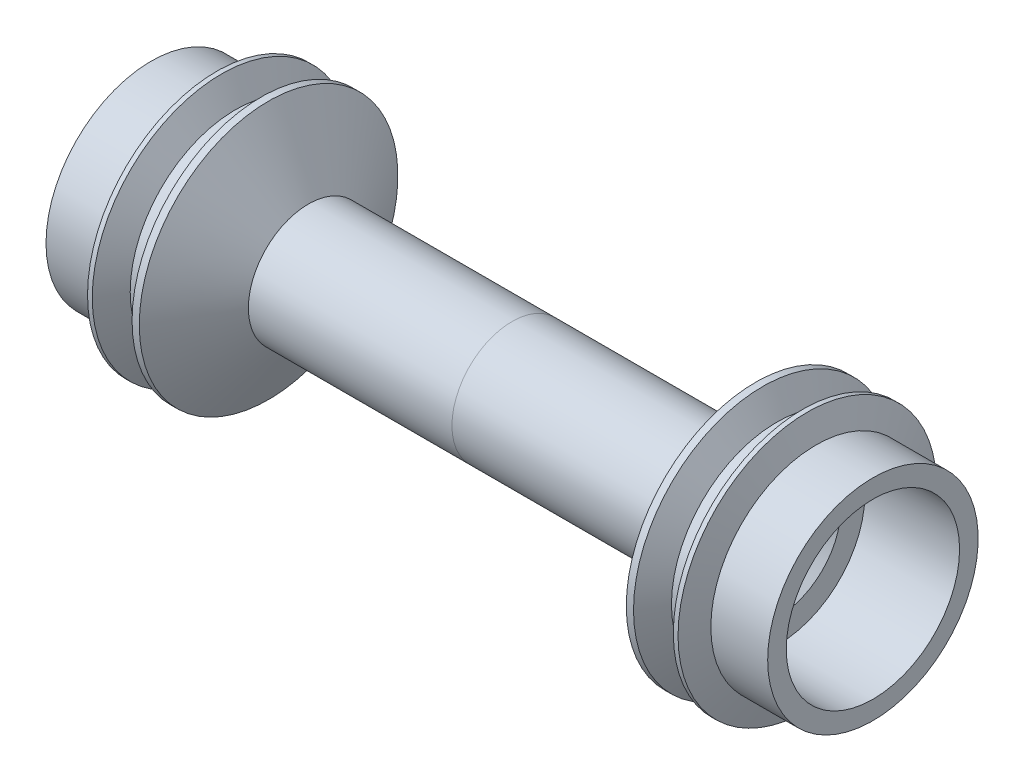
ISO-10303-21;
HEADER;
FILE_DESCRIPTION(('STEP AP214'),'2;1');
FILE_NAME('part.step','',(''),(''),'','','');
FILE_SCHEMA(('AUTOMOTIVE_DESIGN { 1 0 10303 214 1 1 1 1 }'));
ENDSEC;
DATA;
#1=APPLICATION_CONTEXT('core data for automotive mechanical design processes');
#2=APPLICATION_PROTOCOL_DEFINITION('international standard','automotive_design',2000,#1);
#3=PRODUCT_CONTEXT('',#1,'mechanical');
#4=PRODUCT('Part','Part','',(#3));
#5=PRODUCT_RELATED_PRODUCT_CATEGORY('part','',(#4));
#6=PRODUCT_DEFINITION_FORMATION('','',#4);
#7=PRODUCT_DEFINITION_CONTEXT('part definition',#1,'design');
#8=PRODUCT_DEFINITION('design','',#6,#7);
#9=PRODUCT_DEFINITION_SHAPE('','',#8);
#10=(LENGTH_UNIT() NAMED_UNIT(*) SI_UNIT(.MILLI.,.METRE.));
#11=(NAMED_UNIT(*) PLANE_ANGLE_UNIT() SI_UNIT($,.RADIAN.));
#12=(NAMED_UNIT(*) SI_UNIT($,.STERADIAN.) SOLID_ANGLE_UNIT());
#13=UNCERTAINTY_MEASURE_WITH_UNIT(LENGTH_MEASURE(1.E-05),#10,'distance_accuracy_value','');
#14=(GEOMETRIC_REPRESENTATION_CONTEXT(3) GLOBAL_UNCERTAINTY_ASSIGNED_CONTEXT((#13)) GLOBAL_UNIT_ASSIGNED_CONTEXT((#10,
#11,#12)) REPRESENTATION_CONTEXT('',''));
#15=CARTESIAN_POINT('',(0.,0.,0.));
#16=DIRECTION('',(0.,0.,1.));
#17=DIRECTION('',(1.,0.,0.));
#18=AXIS2_PLACEMENT_3D('',#15,#16,#17);
#19=CARTESIAN_POINT('',(13.97,0.,0.));
#20=DIRECTION('',(-1.,0.,0.));
#21=DIRECTION('',(0.,0.,-1.));
#22=AXIS2_PLACEMENT_3D('',#19,#20,#21);
#23=CONICAL_SURFACE('',#22,5.55625,1.0471975511966);
#24=CARTESIAN_POINT('',(13.2367651581292,0.,0.));
#25=DIRECTION('',(-1.,0.,0.));
#26=DIRECTION('',(0.,0.,1.));
#27=AXIS2_PLACEMENT_3D('',#24,#25,#26);
#28=CIRCLE('',#27,6.82625);
#29=CARTESIAN_POINT('',(13.2367651581292,0.,6.82625));
#30=VERTEX_POINT('',#29);
#31=EDGE_CURVE('E177',#30,#30,#28,.T.);
#32=ORIENTED_EDGE('',*,*,#31,.F.);
#33=EDGE_LOOP('',(#32));
#34=FACE_BOUND('',#33,.T.);
#35=CARTESIAN_POINT('',(13.97,0.,0.));
#36=DIRECTION('',(-1.,0.,0.));
#37=DIRECTION('',(0.,0.,1.));
#38=AXIS2_PLACEMENT_3D('',#35,#36,#37);
#39=CIRCLE('',#38,5.55625);
#40=CARTESIAN_POINT('',(13.97,0.,5.55625));
#41=VERTEX_POINT('',#40);
#42=EDGE_CURVE('E12',#41,#41,#39,.T.);
#43=ORIENTED_EDGE('',*,*,#42,.T.);
#44=EDGE_LOOP('',(#43));
#45=FACE_BOUND('',#44,.T.);
#46=ADVANCED_FACE('F59',(#34,#45),#23,.T.);
#47=CARTESIAN_POINT('',(19.05,0.,0.));
#48=DIRECTION('',(1.,0.,0.));
#49=DIRECTION('',(0.,0.,1.));
#50=AXIS2_PLACEMENT_3D('',#47,#48,#49);
#51=CYLINDRICAL_SURFACE('',#50,5.55625);
#52=ORIENTED_EDGE('',*,*,#42,.F.);
#53=EDGE_LOOP('',(#52));
#54=FACE_BOUND('',#53,.T.);
#55=CARTESIAN_POINT('',(14.605,0.,0.));
#56=DIRECTION('',(-1.,0.,0.));
#57=DIRECTION('',(0.,0.,1.));
#58=AXIS2_PLACEMENT_3D('',#55,#56,#57);
#59=CIRCLE('',#58,5.55625);
#60=CARTESIAN_POINT('',(14.605,0.,5.55625));
#61=VERTEX_POINT('',#60);
#62=EDGE_CURVE('E66',#61,#61,#59,.T.);
#63=ORIENTED_EDGE('',*,*,#62,.T.);
#64=EDGE_LOOP('',(#63));
#65=FACE_BOUND('',#64,.T.);
#66=ADVANCED_FACE('F131',(#54,#65),#51,.T.);
#67=CARTESIAN_POINT('',(15.3382348418708,0.,0.));
#68=DIRECTION('',(1.,0.,0.));
#69=DIRECTION('',(0.,0.,1.));
#70=AXIS2_PLACEMENT_3D('',#67,#68,#69);
#71=CONICAL_SURFACE('',#70,6.82625,1.0471975511966);
#72=ORIENTED_EDGE('',*,*,#62,.F.);
#73=EDGE_LOOP('',(#72));
#74=FACE_BOUND('',#73,.T.);
#75=CARTESIAN_POINT('',(15.3382348418708,0.,0.));
#76=DIRECTION('',(-1.,0.,0.));
#77=DIRECTION('',(0.,0.,1.));
#78=AXIS2_PLACEMENT_3D('',#75,#76,#77);
#79=CIRCLE('',#78,6.82625);
#80=CARTESIAN_POINT('',(15.3382348418708,0.,6.82625));
#81=VERTEX_POINT('',#80);
#82=EDGE_CURVE('E124',#81,#81,#79,.T.);
#83=ORIENTED_EDGE('',*,*,#82,.T.);
#84=EDGE_LOOP('',(#83));
#85=FACE_BOUND('',#84,.T.);
#86=ADVANCED_FACE('F133',(#74,#85),#71,.T.);
#87=CARTESIAN_POINT('',(19.05,0.,0.));
#88=DIRECTION('',(1.,0.,0.));
#89=DIRECTION('',(0.,0.,1.));
#90=AXIS2_PLACEMENT_3D('',#87,#88,#89);
#91=CYLINDRICAL_SURFACE('',#90,6.82625);
#92=ORIENTED_EDGE('',*,*,#82,.F.);
#93=EDGE_LOOP('',(#92));
#94=FACE_BOUND('',#93,.T.);
#95=CARTESIAN_POINT('',(15.5877578024819,0.,0.));
#96=DIRECTION('',(-1.,0.,0.));
#97=DIRECTION('',(0.,0.,1.));
#98=AXIS2_PLACEMENT_3D('',#95,#96,#97);
#99=CIRCLE('',#98,6.82625);
#100=CARTESIAN_POINT('',(15.5877578024819,0.,6.82625));
#101=VERTEX_POINT('',#100);
#102=EDGE_CURVE('E120',#101,#101,#99,.T.);
#103=ORIENTED_EDGE('',*,*,#102,.T.);
#104=EDGE_LOOP('',(#103));
#105=FACE_BOUND('',#104,.T.);
#106=ADVANCED_FACE('F136',(#94,#105),#91,.T.);
#107=CARTESIAN_POINT('',(16.05,0.,0.));
#108=DIRECTION('',(-1.,0.,0.));
#109=DIRECTION('',(0.,0.,-1.));
#110=AXIS2_PLACEMENT_3D('',#107,#108,#109);
#111=CONICAL_SURFACE('',#110,5.55625,1.22173047639603);
#112=ORIENTED_EDGE('',*,*,#102,.F.);
#113=EDGE_LOOP('',(#112));
#114=FACE_BOUND('',#113,.T.);
#115=CARTESIAN_POINT('',(16.05,0.,0.));
#116=DIRECTION('',(-1.,0.,0.));
#117=DIRECTION('',(0.,0.,1.));
#118=AXIS2_PLACEMENT_3D('',#115,#116,#117);
#119=CIRCLE('',#118,5.55625);
#120=CARTESIAN_POINT('',(16.05,0.,5.55625));
#121=VERTEX_POINT('',#120);
#122=EDGE_CURVE('E116',#121,#121,#119,.T.);
#123=ORIENTED_EDGE('',*,*,#122,.T.);
#124=EDGE_LOOP('',(#123));
#125=FACE_BOUND('',#124,.T.);
#126=ADVANCED_FACE('F142',(#114,#125),#111,.T.);
#127=CARTESIAN_POINT('',(19.05,0.,0.));
#128=DIRECTION('',(1.,0.,0.));
#129=DIRECTION('',(0.,0.,1.));
#130=AXIS2_PLACEMENT_3D('',#127,#128,#129);
#131=CYLINDRICAL_SURFACE('',#130,5.55625);
#132=ORIENTED_EDGE('',*,*,#122,.F.);
#133=EDGE_LOOP('',(#132));
#134=FACE_BOUND('',#133,.T.);
#135=CARTESIAN_POINT('',(19.05,0.,0.));
#136=DIRECTION('',(-1.,0.,0.));
#137=DIRECTION('',(0.,0.,1.));
#138=AXIS2_PLACEMENT_3D('',#135,#136,#137);
#139=CIRCLE('',#138,5.55625);
#140=CARTESIAN_POINT('',(19.05,0.,5.55625));
#141=VERTEX_POINT('',#140);
#142=EDGE_CURVE('E112',#141,#141,#139,.T.);
#143=ORIENTED_EDGE('',*,*,#142,.T.);
#144=EDGE_LOOP('',(#143));
#145=FACE_BOUND('',#144,.T.);
#146=ADVANCED_FACE('F148',(#134,#145),#131,.T.);
#147=CARTESIAN_POINT('',(19.05,0.,0.));
#148=DIRECTION('',(-1.,0.,0.));
#149=DIRECTION('',(0.,0.,-1.));
#150=AXIS2_PLACEMENT_3D('',#147,#148,#149);
#151=PLANE('',#150);
#152=CARTESIAN_POINT('',(19.05,0.,0.));
#153=DIRECTION('',(-1.,0.,0.));
#154=DIRECTION('',(0.,0.,1.));
#155=AXIS2_PLACEMENT_3D('',#152,#153,#154);
#156=CIRCLE('',#155,4.575);
#157=CARTESIAN_POINT('',(19.05,0.,4.575));
#158=VERTEX_POINT('',#157);
#159=EDGE_CURVE('E108',#158,#158,#156,.T.);
#160=ORIENTED_EDGE('',*,*,#159,.T.);
#161=EDGE_LOOP('',(#160));
#162=FACE_BOUND('',#161,.T.);
#163=ORIENTED_EDGE('',*,*,#142,.F.);
#164=EDGE_LOOP('',(#163));
#165=FACE_BOUND('',#164,.T.);
#166=ADVANCED_FACE('F154',(#162,#165),#151,.F.);
#167=CARTESIAN_POINT('',(19.05,0.,0.));
#168=DIRECTION('',(1.,0.,0.));
#169=DIRECTION('',(0.,0.,1.));
#170=AXIS2_PLACEMENT_3D('',#167,#168,#169);
#171=CYLINDRICAL_SURFACE('',#170,4.575);
#172=CARTESIAN_POINT('',(14.05,0.,0.));
#173=DIRECTION('',(-1.,0.,0.));
#174=DIRECTION('',(0.,0.,1.));
#175=AXIS2_PLACEMENT_3D('',#172,#173,#174);
#176=CIRCLE('',#175,4.575);
#177=CARTESIAN_POINT('',(14.05,0.,4.575));
#178=VERTEX_POINT('',#177);
#179=EDGE_CURVE('E104',#178,#178,#176,.T.);
#180=ORIENTED_EDGE('',*,*,#179,.T.);
#181=EDGE_LOOP('',(#180));
#182=FACE_BOUND('',#181,.T.);
#183=ORIENTED_EDGE('',*,*,#159,.F.);
#184=EDGE_LOOP('',(#183));
#185=FACE_BOUND('',#184,.T.);
#186=ADVANCED_FACE('F159',(#182,#185),#171,.F.);
#187=CARTESIAN_POINT('',(14.05,0.,0.));
#188=DIRECTION('',(-1.,0.,0.));
#189=DIRECTION('',(0.,0.,-1.));
#190=AXIS2_PLACEMENT_3D('',#187,#188,#189);
#191=PLANE('',#190);
#192=CARTESIAN_POINT('',(14.05,0.,0.));
#193=DIRECTION('',(-1.,0.,0.));
#194=DIRECTION('',(0.,0.,1.));
#195=AXIS2_PLACEMENT_3D('',#192,#193,#194);
#196=CIRCLE('',#195,3.305);
#197=CARTESIAN_POINT('',(14.05,0.,3.305));
#198=VERTEX_POINT('',#197);
#199=EDGE_CURVE('E100',#198,#198,#196,.T.);
#200=ORIENTED_EDGE('',*,*,#199,.T.);
#201=EDGE_LOOP('',(#200));
#202=FACE_BOUND('',#201,.T.);
#203=ORIENTED_EDGE('',*,*,#179,.F.);
#204=EDGE_LOOP('',(#203));
#205=FACE_BOUND('',#204,.T.);
#206=ADVANCED_FACE('F165',(#202,#205),#191,.F.);
#207=CARTESIAN_POINT('',(14.05,0.,0.));
#208=DIRECTION('',(1.,0.,0.));
#209=DIRECTION('',(0.,0.,1.));
#210=AXIS2_PLACEMENT_3D('',#207,#208,#209);
#211=CONICAL_SURFACE('',#210,3.305,0.785398163397448);
#212=CARTESIAN_POINT('',(13.542,0.,0.));
#213=DIRECTION('',(-1.,0.,0.));
#214=DIRECTION('',(0.,0.,1.));
#215=AXIS2_PLACEMENT_3D('',#212,#213,#214);
#216=CIRCLE('',#215,2.797);
#217=CARTESIAN_POINT('',(13.542,0.,2.797));
#218=VERTEX_POINT('',#217);
#219=EDGE_CURVE('E96',#218,#218,#216,.T.);
#220=ORIENTED_EDGE('',*,*,#219,.T.);
#221=EDGE_LOOP('',(#220));
#222=FACE_BOUND('',#221,.T.);
#223=ORIENTED_EDGE('',*,*,#199,.F.);
#224=EDGE_LOOP('',(#223));
#225=FACE_BOUND('',#224,.T.);
#226=ADVANCED_FACE('F229',(#222,#225),#211,.F.);
#227=CARTESIAN_POINT('',(13.542,0.,0.));
#228=DIRECTION('',(-1.,0.,0.));
#229=DIRECTION('',(0.,0.,-1.));
#230=AXIS2_PLACEMENT_3D('',#227,#228,#229);
#231=PLANE('',#230);
#232=CARTESIAN_POINT('',(13.542,0.,0.));
#233=DIRECTION('',(-1.,0.,0.));
#234=DIRECTION('',(0.,0.,1.));
#235=AXIS2_PLACEMENT_3D('',#232,#233,#234);
#236=CIRCLE('',#235,1.7145);
#237=CARTESIAN_POINT('',(13.542,0.,1.7145));
#238=VERTEX_POINT('',#237);
#239=EDGE_CURVE('E86',#238,#238,#236,.T.);
#240=ORIENTED_EDGE('',*,*,#239,.T.);
#241=EDGE_LOOP('',(#240));
#242=FACE_BOUND('',#241,.T.);
#243=ORIENTED_EDGE('',*,*,#219,.F.);
#244=EDGE_LOOP('',(#243));
#245=FACE_BOUND('',#244,.T.);
#246=ADVANCED_FACE('F225',(#242,#245),#231,.F.);
#247=CARTESIAN_POINT('',(19.05,0.,0.));
#248=DIRECTION('',(1.,0.,0.));
#249=DIRECTION('',(0.,0.,1.));
#250=AXIS2_PLACEMENT_3D('',#247,#248,#249);
#251=CYLINDRICAL_SURFACE('',#250,1.7145);
#252=CARTESIAN_POINT('',(9.225,0.,0.));
#253=DIRECTION('',(-1.,0.,0.));
#254=DIRECTION('',(0.,0.,1.));
#255=AXIS2_PLACEMENT_3D('',#252,#253,#254);
#256=CIRCLE('',#255,1.7145);
#257=CARTESIAN_POINT('',(9.225,0.,1.7145));
#258=VERTEX_POINT('',#257);
#259=EDGE_CURVE('E80',#258,#258,#256,.T.);
#260=ORIENTED_EDGE('',*,*,#259,.T.);
#261=EDGE_LOOP('',(#260));
#262=FACE_BOUND('',#261,.T.);
#263=ORIENTED_EDGE('',*,*,#239,.F.);
#264=EDGE_LOOP('',(#263));
#265=FACE_BOUND('',#264,.T.);
#266=ADVANCED_FACE('F221',(#262,#265),#251,.F.);
#267=CARTESIAN_POINT('',(9.225,0.,0.));
#268=DIRECTION('',(-1.,0.,0.));
#269=DIRECTION('',(0.,0.,-1.));
#270=AXIS2_PLACEMENT_3D('',#267,#268,#269);
#271=PLANE('',#270);
#272=ORIENTED_EDGE('',*,*,#259,.F.);
#273=EDGE_LOOP('',(#272));
#274=FACE_BOUND('',#273,.T.);
#275=ADVANCED_FACE('F73',(#274),#271,.F.);
#276=CARTESIAN_POINT('',(6.5,0.,0.));
#277=DIRECTION('',(-1.,0.,0.));
#278=DIRECTION('',(0.,0.,-1.));
#279=AXIS2_PLACEMENT_3D('',#276,#277,#278);
#280=CONICAL_SURFACE('',#279,1.6,0.78539816339745);
#281=CARTESIAN_POINT('',(8.09999999999999,0.,0.));
#282=VERTEX_POINT('',#281);
#283=VERTEX_LOOP('',#282);
#284=FACE_BOUND('',#283,.T.);
#285=CARTESIAN_POINT('',(6.5,0.,0.));
#286=DIRECTION('',(-1.,0.,0.));
#287=DIRECTION('',(0.,0.,1.));
#288=AXIS2_PLACEMENT_3D('',#285,#286,#287);
#289=CIRCLE('',#288,1.6);
#290=CARTESIAN_POINT('',(6.5,0.,1.6));
#291=VERTEX_POINT('',#290);
#292=EDGE_CURVE('E77',#291,#291,#289,.T.);
#293=ORIENTED_EDGE('',*,*,#292,.T.);
#294=EDGE_LOOP('',(#293));
#295=FACE_BOUND('',#294,.T.);
#296=ADVANCED_FACE('F69',(#284,#295),#280,.F.);
#297=CARTESIAN_POINT('',(19.05,0.,0.));
#298=DIRECTION('',(1.,0.,0.));
#299=DIRECTION('',(0.,0.,1.));
#300=AXIS2_PLACEMENT_3D('',#297,#298,#299);
#301=CYLINDRICAL_SURFACE('',#300,1.6);
#302=ORIENTED_EDGE('',*,*,#292,.F.);
#303=EDGE_LOOP('',(#302));
#304=FACE_BOUND('',#303,.T.);
#305=CARTESIAN_POINT('',(0.,0.,0.));
#306=DIRECTION('',(-1.,0.,0.));
#307=DIRECTION('',(0.,0.,1.));
#308=AXIS2_PLACEMENT_3D('',#305,#306,#307);
#309=CIRCLE('',#308,1.6);
#310=CARTESIAN_POINT('',(0.,0.,1.6));
#311=VERTEX_POINT('',#310);
#312=EDGE_CURVE('E81',#311,#311,#309,.T.);
#313=ORIENTED_EDGE('',*,*,#312,.T.);
#314=EDGE_LOOP('',(#313));
#315=FACE_BOUND('',#314,.T.);
#316=ADVANCED_FACE('F72',(#304,#315),#301,.F.);
#317=CARTESIAN_POINT('',(0.,0.,0.));
#318=DIRECTION('',(1.,0.,0.));
#319=DIRECTION('',(0.,0.,1.));
#320=AXIS2_PLACEMENT_3D('',#317,#318,#319);
#321=PLANE('',#320);
#322=CARTESIAN_POINT('',(0.,0.,0.));
#323=DIRECTION('',(-1.,0.,0.));
#324=DIRECTION('',(0.,0.,1.));
#325=AXIS2_PLACEMENT_3D('',#322,#323,#324);
#326=CIRCLE('',#325,3.175);
#327=CARTESIAN_POINT('',(0.,0.,3.175));
#328=VERTEX_POINT('',#327);
#329=EDGE_CURVE('E89',#328,#328,#326,.T.);
#330=ORIENTED_EDGE('',*,*,#329,.T.);
#331=EDGE_LOOP('',(#330));
#332=FACE_BOUND('',#331,.T.);
#333=ORIENTED_EDGE('',*,*,#312,.F.);
#334=EDGE_LOOP('',(#333));
#335=FACE_BOUND('',#334,.T.);
#336=ADVANCED_FACE('F194',(#332,#335),#321,.F.);
#337=CARTESIAN_POINT('',(19.05,0.,0.));
#338=DIRECTION('',(1.,0.,0.));
#339=DIRECTION('',(0.,0.,1.));
#340=AXIS2_PLACEMENT_3D('',#337,#338,#339);
#341=CYLINDRICAL_SURFACE('',#340,3.175);
#342=ORIENTED_EDGE('',*,*,#329,.F.);
#343=EDGE_LOOP('',(#342));
#344=FACE_BOUND('',#343,.T.);
#345=CARTESIAN_POINT('',(10.7477149877506,0.,0.));
#346=DIRECTION('',(-1.,0.,0.));
#347=DIRECTION('',(0.,0.,1.));
#348=AXIS2_PLACEMENT_3D('',#345,#346,#347);
#349=CIRCLE('',#348,3.175);
#350=CARTESIAN_POINT('',(10.7477149877506,0.,3.175));
#351=VERTEX_POINT('',#350);
#352=EDGE_CURVE('E185',#351,#351,#349,.T.);
#353=ORIENTED_EDGE('',*,*,#352,.T.);
#354=EDGE_LOOP('',(#353));
#355=FACE_BOUND('',#354,.T.);
#356=ADVANCED_FACE('F197',(#344,#355),#341,.T.);
#357=CARTESIAN_POINT('',(12.8557651581292,0.,0.));
#358=DIRECTION('',(1.,0.,0.));
#359=DIRECTION('',(0.,0.,1.));
#360=AXIS2_PLACEMENT_3D('',#357,#358,#359);
#361=CONICAL_SURFACE('',#360,6.82625,1.0471975511966);
#362=ORIENTED_EDGE('',*,*,#352,.F.);
#363=EDGE_LOOP('',(#362));
#364=FACE_BOUND('',#363,.T.);
#365=CARTESIAN_POINT('',(12.8557651581292,0.,0.));
#366=DIRECTION('',(-1.,0.,0.));
#367=DIRECTION('',(0.,0.,1.));
#368=AXIS2_PLACEMENT_3D('',#365,#366,#367);
#369=CIRCLE('',#368,6.82625);
#370=CARTESIAN_POINT('',(12.8557651581292,0.,6.82625));
#371=VERTEX_POINT('',#370);
#372=EDGE_CURVE('E181',#371,#371,#369,.T.);
#373=ORIENTED_EDGE('',*,*,#372,.T.);
#374=EDGE_LOOP('',(#373));
#375=FACE_BOUND('',#374,.T.);
#376=ADVANCED_FACE('F200',(#364,#375),#361,.T.);
#377=CARTESIAN_POINT('',(19.05,0.,0.));
#378=DIRECTION('',(1.,0.,0.));
#379=DIRECTION('',(0.,0.,1.));
#380=AXIS2_PLACEMENT_3D('',#377,#378,#379);
#381=CYLINDRICAL_SURFACE('',#380,6.82625);
#382=ORIENTED_EDGE('',*,*,#372,.F.);
#383=EDGE_LOOP('',(#382));
#384=FACE_BOUND('',#383,.T.);
#385=ORIENTED_EDGE('',*,*,#31,.T.);
#386=EDGE_LOOP('',(#385));
#387=FACE_BOUND('',#386,.T.);
#388=ADVANCED_FACE('F206',(#384,#387),#381,.T.);
#389=CLOSED_SHELL('',(#46,#66,#86,#106,#126,#146,#166,#186,#206,#226,#246,#266,#275,#296,#316,
#336,#356,#376,#388));
#390=MANIFOLD_SOLID_BREP('B2',#389);
#391=CARTESIAN_POINT('',(-13.97,0.,0.));
#392=DIRECTION('',(1.,0.,0.));
#393=DIRECTION('',(0.,0.,-1.));
#394=AXIS2_PLACEMENT_3D('',#391,#392,#393);
#395=CONICAL_SURFACE('',#394,5.55625,1.0471975511966);
#396=CARTESIAN_POINT('',(-13.2367651581292,0.,0.));
#397=DIRECTION('',(-1.,0.,0.));
#398=DIRECTION('',(0.,0.,1.));
#399=AXIS2_PLACEMENT_3D('',#396,#397,#398);
#400=CIRCLE('',#399,6.82625);
#401=CARTESIAN_POINT('',(-13.2367651581292,0.,6.82625));
#402=VERTEX_POINT('',#401);
#403=EDGE_CURVE('E509',#402,#402,#400,.T.);
#404=ORIENTED_EDGE('',*,*,#403,.T.);
#405=EDGE_LOOP('',(#404));
#406=FACE_BOUND('',#405,.T.);
#407=CARTESIAN_POINT('',(-13.97,0.,0.));
#408=DIRECTION('',(-1.,0.,0.));
#409=DIRECTION('',(0.,0.,1.));
#410=AXIS2_PLACEMENT_3D('',#407,#408,#409);
#411=CIRCLE('',#410,5.55625);
#412=CARTESIAN_POINT('',(-13.97,0.,5.55625));
#413=VERTEX_POINT('',#412);
#414=EDGE_CURVE('E418',#413,#413,#411,.T.);
#415=ORIENTED_EDGE('',*,*,#414,.F.);
#416=EDGE_LOOP('',(#415));
#417=FACE_BOUND('',#416,.T.);
#418=ADVANCED_FACE('F360',(#406,#417),#395,.T.);
#419=CARTESIAN_POINT('',(-19.05,0.,0.));
#420=DIRECTION('',(-1.,0.,0.));
#421=DIRECTION('',(0.,0.,1.));
#422=AXIS2_PLACEMENT_3D('',#419,#420,#421);
#423=CYLINDRICAL_SURFACE('',#422,5.55625);
#424=ORIENTED_EDGE('',*,*,#414,.T.);
#425=EDGE_LOOP('',(#424));
#426=FACE_BOUND('',#425,.T.);
#427=CARTESIAN_POINT('',(-14.605,0.,0.));
#428=DIRECTION('',(-1.,0.,0.));
#429=DIRECTION('',(0.,0.,1.));
#430=AXIS2_PLACEMENT_3D('',#427,#428,#429);
#431=CIRCLE('',#430,5.55625);
#432=CARTESIAN_POINT('',(-14.605,0.,5.55625));
#433=VERTEX_POINT('',#432);
#434=EDGE_CURVE('E415',#433,#433,#431,.T.);
#435=ORIENTED_EDGE('',*,*,#434,.F.);
#436=EDGE_LOOP('',(#435));
#437=FACE_BOUND('',#436,.T.);
#438=ADVANCED_FACE('F438',(#426,#437),#423,.T.);
#439=CARTESIAN_POINT('',(-15.3382348418708,0.,0.));
#440=DIRECTION('',(-1.,0.,0.));
#441=DIRECTION('',(0.,0.,1.));
#442=AXIS2_PLACEMENT_3D('',#439,#440,#441);
#443=CONICAL_SURFACE('',#442,6.82625,1.0471975511966);
#444=ORIENTED_EDGE('',*,*,#434,.T.);
#445=EDGE_LOOP('',(#444));
#446=FACE_BOUND('',#445,.T.);
#447=CARTESIAN_POINT('',(-15.3382348418708,0.,0.));
#448=DIRECTION('',(-1.,0.,0.));
#449=DIRECTION('',(0.,0.,1.));
#450=AXIS2_PLACEMENT_3D('',#447,#448,#449);
#451=CIRCLE('',#450,6.82625);
#452=CARTESIAN_POINT('',(-15.3382348418708,0.,6.82625));
#453=VERTEX_POINT('',#452);
#454=EDGE_CURVE('E412',#453,#453,#451,.T.);
#455=ORIENTED_EDGE('',*,*,#454,.F.);
#456=EDGE_LOOP('',(#455));
#457=FACE_BOUND('',#456,.T.);
#458=ADVANCED_FACE('F443',(#446,#457),#443,.T.);
#459=CARTESIAN_POINT('',(-19.05,0.,0.));
#460=DIRECTION('',(-1.,0.,0.));
#461=DIRECTION('',(0.,0.,1.));
#462=AXIS2_PLACEMENT_3D('',#459,#460,#461);
#463=CYLINDRICAL_SURFACE('',#462,6.82625);
#464=ORIENTED_EDGE('',*,*,#454,.T.);
#465=EDGE_LOOP('',(#464));
#466=FACE_BOUND('',#465,.T.);
#467=CARTESIAN_POINT('',(-15.5877578024819,0.,0.));
#468=DIRECTION('',(-1.,0.,0.));
#469=DIRECTION('',(0.,0.,1.));
#470=AXIS2_PLACEMENT_3D('',#467,#468,#469);
#471=CIRCLE('',#470,6.82625);
#472=CARTESIAN_POINT('',(-15.5877578024819,0.,6.82625));
#473=VERTEX_POINT('',#472);
#474=EDGE_CURVE('E409',#473,#473,#471,.T.);
#475=ORIENTED_EDGE('',*,*,#474,.F.);
#476=EDGE_LOOP('',(#475));
#477=FACE_BOUND('',#476,.T.);
#478=ADVANCED_FACE('F451',(#466,#477),#463,.T.);
#479=CARTESIAN_POINT('',(-16.05,0.,0.));
#480=DIRECTION('',(1.,0.,0.));
#481=DIRECTION('',(0.,0.,-1.));
#482=AXIS2_PLACEMENT_3D('',#479,#480,#481);
#483=CONICAL_SURFACE('',#482,5.55625,1.22173047639603);
#484=ORIENTED_EDGE('',*,*,#474,.T.);
#485=EDGE_LOOP('',(#484));
#486=FACE_BOUND('',#485,.T.);
#487=CARTESIAN_POINT('',(-16.05,0.,0.));
#488=DIRECTION('',(-1.,0.,0.));
#489=DIRECTION('',(0.,0.,1.));
#490=AXIS2_PLACEMENT_3D('',#487,#488,#489);
#491=CIRCLE('',#490,5.55625);
#492=CARTESIAN_POINT('',(-16.05,0.,5.55625));
#493=VERTEX_POINT('',#492);
#494=EDGE_CURVE('E406',#493,#493,#491,.T.);
#495=ORIENTED_EDGE('',*,*,#494,.F.);
#496=EDGE_LOOP('',(#495));
#497=FACE_BOUND('',#496,.T.);
#498=ADVANCED_FACE('F455',(#486,#497),#483,.T.);
#499=CARTESIAN_POINT('',(-19.05,0.,0.));
#500=DIRECTION('',(-1.,0.,0.));
#501=DIRECTION('',(0.,0.,1.));
#502=AXIS2_PLACEMENT_3D('',#499,#500,#501);
#503=CYLINDRICAL_SURFACE('',#502,5.55625);
#504=ORIENTED_EDGE('',*,*,#494,.T.);
#505=EDGE_LOOP('',(#504));
#506=FACE_BOUND('',#505,.T.);
#507=CARTESIAN_POINT('',(-19.05,0.,0.));
#508=DIRECTION('',(-1.,0.,0.));
#509=DIRECTION('',(0.,0.,1.));
#510=AXIS2_PLACEMENT_3D('',#507,#508,#509);
#511=CIRCLE('',#510,5.55625);
#512=CARTESIAN_POINT('',(-19.05,0.,5.55625));
#513=VERTEX_POINT('',#512);
#514=EDGE_CURVE('E403',#513,#513,#511,.T.);
#515=ORIENTED_EDGE('',*,*,#514,.F.);
#516=EDGE_LOOP('',(#515));
#517=FACE_BOUND('',#516,.T.);
#518=ADVANCED_FACE('F459',(#506,#517),#503,.T.);
#519=CARTESIAN_POINT('',(-19.05,0.,0.));
#520=DIRECTION('',(1.,0.,0.));
#521=DIRECTION('',(0.,0.,-1.));
#522=AXIS2_PLACEMENT_3D('',#519,#520,#521);
#523=PLANE('',#522);
#524=CARTESIAN_POINT('',(-19.05,0.,0.));
#525=DIRECTION('',(1.,0.,0.));
#526=DIRECTION('',(0.,0.,-1.));
#527=AXIS2_PLACEMENT_3D('',#524,#525,#526);
#528=CIRCLE('',#527,5.083);
#529=CARTESIAN_POINT('',(-19.05,0.,-5.083));
#530=VERTEX_POINT('',#529);
#531=EDGE_CURVE('E57',#530,#530,#528,.T.);
#532=ORIENTED_EDGE('',*,*,#531,.T.);
#533=EDGE_LOOP('',(#532));
#534=FACE_BOUND('',#533,.T.);
#535=ORIENTED_EDGE('',*,*,#514,.T.);
#536=EDGE_LOOP('',(#535));
#537=FACE_BOUND('',#536,.T.);
#538=ADVANCED_FACE('F463',(#534,#537),#523,.F.);
#539=CARTESIAN_POINT('',(-19.05,0.,0.));
#540=DIRECTION('',(-1.,0.,0.));
#541=DIRECTION('',(0.,0.,1.));
#542=AXIS2_PLACEMENT_3D('',#539,#540,#541);
#543=CYLINDRICAL_SURFACE('',#542,4.575);
#544=CARTESIAN_POINT('',(-18.542,0.,0.));
#545=DIRECTION('',(1.,0.,0.));
#546=DIRECTION('',(0.,0.,-1.));
#547=AXIS2_PLACEMENT_3D('',#544,#545,#546);
#548=CIRCLE('',#547,4.575);
#549=CARTESIAN_POINT('',(-18.542,0.,-4.575));
#550=VERTEX_POINT('',#549);
#551=EDGE_CURVE('E368',#550,#550,#548,.F.);
#552=ORIENTED_EDGE('',*,*,#551,.T.);
#553=EDGE_LOOP('',(#552));
#554=FACE_BOUND('',#553,.T.);
#555=CARTESIAN_POINT('',(-14.05,0.,0.));
#556=DIRECTION('',(-1.,0.,0.));
#557=DIRECTION('',(0.,0.,1.));
#558=AXIS2_PLACEMENT_3D('',#555,#556,#557);
#559=CIRCLE('',#558,4.575);
#560=CARTESIAN_POINT('',(-14.05,0.,4.575));
#561=VERTEX_POINT('',#560);
#562=EDGE_CURVE('E400',#561,#561,#559,.T.);
#563=ORIENTED_EDGE('',*,*,#562,.F.);
#564=EDGE_LOOP('',(#563));
#565=FACE_BOUND('',#564,.T.);
#566=ADVANCED_FACE('F423',(#554,#565),#543,.F.);
#567=CARTESIAN_POINT('',(-14.05,0.,0.));
#568=DIRECTION('',(1.,0.,0.));
#569=DIRECTION('',(0.,0.,-1.));
#570=AXIS2_PLACEMENT_3D('',#567,#568,#569);
#571=PLANE('',#570);
#572=CARTESIAN_POINT('',(-14.05,0.,0.));
#573=DIRECTION('',(-1.,0.,0.));
#574=DIRECTION('',(0.,0.,1.));
#575=AXIS2_PLACEMENT_3D('',#572,#573,#574);
#576=CIRCLE('',#575,3.305);
#577=CARTESIAN_POINT('',(-14.05,0.,3.305));
#578=VERTEX_POINT('',#577);
#579=EDGE_CURVE('E397',#578,#578,#576,.T.);
#580=ORIENTED_EDGE('',*,*,#579,.F.);
#581=EDGE_LOOP('',(#580));
#582=FACE_BOUND('',#581,.T.);
#583=ORIENTED_EDGE('',*,*,#562,.T.);
#584=EDGE_LOOP('',(#583));
#585=FACE_BOUND('',#584,.T.);
#586=ADVANCED_FACE('F469',(#582,#585),#571,.F.);
#587=CARTESIAN_POINT('',(-14.05,0.,0.));
#588=DIRECTION('',(-1.,0.,0.));
#589=DIRECTION('',(0.,0.,1.));
#590=AXIS2_PLACEMENT_3D('',#587,#588,#589);
#591=CONICAL_SURFACE('',#590,3.305,0.785398163397448);
#592=CARTESIAN_POINT('',(-13.542,0.,0.));
#593=DIRECTION('',(-1.,0.,0.));
#594=DIRECTION('',(0.,0.,1.));
#595=AXIS2_PLACEMENT_3D('',#592,#593,#594);
#596=CIRCLE('',#595,2.797);
#597=CARTESIAN_POINT('',(-13.542,0.,2.797));
#598=VERTEX_POINT('',#597);
#599=EDGE_CURVE('E394',#598,#598,#596,.T.);
#600=ORIENTED_EDGE('',*,*,#599,.F.);
#601=EDGE_LOOP('',(#600));
#602=FACE_BOUND('',#601,.T.);
#603=ORIENTED_EDGE('',*,*,#579,.T.);
#604=EDGE_LOOP('',(#603));
#605=FACE_BOUND('',#604,.T.);
#606=ADVANCED_FACE('F472',(#602,#605),#591,.F.);
#607=CARTESIAN_POINT('',(-13.542,0.,0.));
#608=DIRECTION('',(1.,0.,0.));
#609=DIRECTION('',(0.,0.,-1.));
#610=AXIS2_PLACEMENT_3D('',#607,#608,#609);
#611=PLANE('',#610);
#612=CARTESIAN_POINT('',(-13.542,0.,0.));
#613=DIRECTION('',(-1.,0.,0.));
#614=DIRECTION('',(0.,0.,1.));
#615=AXIS2_PLACEMENT_3D('',#612,#613,#614);
#616=CIRCLE('',#615,1.7145);
#617=CARTESIAN_POINT('',(-13.542,0.,1.7145));
#618=VERTEX_POINT('',#617);
#619=EDGE_CURVE('E385',#618,#618,#616,.T.);
#620=ORIENTED_EDGE('',*,*,#619,.F.);
#621=EDGE_LOOP('',(#620));
#622=FACE_BOUND('',#621,.T.);
#623=ORIENTED_EDGE('',*,*,#599,.T.);
#624=EDGE_LOOP('',(#623));
#625=FACE_BOUND('',#624,.T.);
#626=ADVANCED_FACE('F476',(#622,#625),#611,.F.);
#627=CARTESIAN_POINT('',(-19.05,0.,0.));
#628=DIRECTION('',(-1.,0.,0.));
#629=DIRECTION('',(0.,0.,1.));
#630=AXIS2_PLACEMENT_3D('',#627,#628,#629);
#631=CYLINDRICAL_SURFACE('',#630,1.7145);
#632=CARTESIAN_POINT('',(-9.225,0.,0.));
#633=DIRECTION('',(-1.,0.,0.));
#634=DIRECTION('',(0.,0.,1.));
#635=AXIS2_PLACEMENT_3D('',#632,#633,#634);
#636=CIRCLE('',#635,1.7145);
#637=CARTESIAN_POINT('',(-9.225,0.,1.7145));
#638=VERTEX_POINT('',#637);
#639=EDGE_CURVE('E381',#638,#638,#636,.T.);
#640=ORIENTED_EDGE('',*,*,#639,.F.);
#641=EDGE_LOOP('',(#640));
#642=FACE_BOUND('',#641,.T.);
#643=ORIENTED_EDGE('',*,*,#619,.T.);
#644=EDGE_LOOP('',(#643));
#645=FACE_BOUND('',#644,.T.);
#646=ADVANCED_FACE('F480',(#642,#645),#631,.F.);
#647=CARTESIAN_POINT('',(-9.225,0.,0.));
#648=DIRECTION('',(1.,0.,0.));
#649=DIRECTION('',(0.,0.,-1.));
#650=AXIS2_PLACEMENT_3D('',#647,#648,#649);
#651=PLANE('',#650);
#652=ORIENTED_EDGE('',*,*,#639,.T.);
#653=EDGE_LOOP('',(#652));
#654=FACE_BOUND('',#653,.T.);
#655=ADVANCED_FACE('F375',(#654),#651,.F.);
#656=CARTESIAN_POINT('',(-6.5,0.,0.));
#657=DIRECTION('',(1.,0.,0.));
#658=DIRECTION('',(0.,0.,-1.));
#659=AXIS2_PLACEMENT_3D('',#656,#657,#658);
#660=CONICAL_SURFACE('',#659,1.6,0.78539816339745);
#661=CARTESIAN_POINT('',(-8.09999999999999,0.,0.));
#662=VERTEX_POINT('',#661);
#663=VERTEX_LOOP('',#662);
#664=FACE_BOUND('',#663,.T.);
#665=CARTESIAN_POINT('',(-6.5,0.,0.));
#666=DIRECTION('',(-1.,0.,0.));
#667=DIRECTION('',(0.,0.,1.));
#668=AXIS2_PLACEMENT_3D('',#665,#666,#667);
#669=CIRCLE('',#668,1.6);
#670=CARTESIAN_POINT('',(-6.5,0.,1.6));
#671=VERTEX_POINT('',#670);
#672=EDGE_CURVE('E379',#671,#671,#669,.T.);
#673=ORIENTED_EDGE('',*,*,#672,.F.);
#674=EDGE_LOOP('',(#673));
#675=FACE_BOUND('',#674,.T.);
#676=ADVANCED_FACE('F371',(#664,#675),#660,.F.);
#677=CARTESIAN_POINT('',(-19.05,0.,0.));
#678=DIRECTION('',(-1.,0.,0.));
#679=DIRECTION('',(0.,0.,1.));
#680=AXIS2_PLACEMENT_3D('',#677,#678,#679);
#681=CYLINDRICAL_SURFACE('',#680,1.6);
#682=ORIENTED_EDGE('',*,*,#672,.T.);
#683=EDGE_LOOP('',(#682));
#684=FACE_BOUND('',#683,.T.);
#685=CARTESIAN_POINT('',(0.,0.,0.));
#686=DIRECTION('',(-1.,0.,0.));
#687=DIRECTION('',(0.,0.,1.));
#688=AXIS2_PLACEMENT_3D('',#685,#686,#687);
#689=CIRCLE('',#688,1.6);
#690=CARTESIAN_POINT('',(0.,0.,1.6));
#691=VERTEX_POINT('',#690);
#692=EDGE_CURVE('E382',#691,#691,#689,.T.);
#693=ORIENTED_EDGE('',*,*,#692,.F.);
#694=EDGE_LOOP('',(#693));
#695=FACE_BOUND('',#694,.T.);
#696=ADVANCED_FACE('F374',(#684,#695),#681,.F.);
#697=CARTESIAN_POINT('',(0.,0.,0.));
#698=DIRECTION('',(-1.,0.,0.));
#699=DIRECTION('',(0.,0.,1.));
#700=AXIS2_PLACEMENT_3D('',#697,#698,#699);
#701=PLANE('',#700);
#702=CARTESIAN_POINT('',(0.,0.,0.));
#703=DIRECTION('',(-1.,0.,0.));
#704=DIRECTION('',(0.,0.,1.));
#705=AXIS2_PLACEMENT_3D('',#702,#703,#704);
#706=CIRCLE('',#705,3.175);
#707=CARTESIAN_POINT('',(0.,0.,3.175));
#708=VERTEX_POINT('',#707);
#709=EDGE_CURVE('E388',#708,#708,#706,.T.);
#710=ORIENTED_EDGE('',*,*,#709,.F.);
#711=EDGE_LOOP('',(#710));
#712=FACE_BOUND('',#711,.T.);
#713=ORIENTED_EDGE('',*,*,#692,.T.);
#714=EDGE_LOOP('',(#713));
#715=FACE_BOUND('',#714,.T.);
#716=ADVANCED_FACE('F490',(#712,#715),#701,.F.);
#717=CARTESIAN_POINT('',(-19.05,0.,0.));
#718=DIRECTION('',(-1.,0.,0.));
#719=DIRECTION('',(0.,0.,1.));
#720=AXIS2_PLACEMENT_3D('',#717,#718,#719);
#721=CYLINDRICAL_SURFACE('',#720,3.175);
#722=ORIENTED_EDGE('',*,*,#709,.T.);
#723=EDGE_LOOP('',(#722));
#724=FACE_BOUND('',#723,.T.);
#725=CARTESIAN_POINT('',(-10.7477149877506,0.,0.));
#726=DIRECTION('',(-1.,0.,0.));
#727=DIRECTION('',(0.,0.,1.));
#728=AXIS2_PLACEMENT_3D('',#725,#726,#727);
#729=CIRCLE('',#728,3.175);
#730=CARTESIAN_POINT('',(-10.7477149877506,0.,3.175));
#731=VERTEX_POINT('',#730);
#732=EDGE_CURVE('E505',#731,#731,#729,.T.);
#733=ORIENTED_EDGE('',*,*,#732,.F.);
#734=EDGE_LOOP('',(#733));
#735=FACE_BOUND('',#734,.T.);
#736=ADVANCED_FACE('F493',(#724,#735),#721,.T.);
#737=CARTESIAN_POINT('',(-12.8557651581292,0.,0.));
#738=DIRECTION('',(-1.,0.,0.));
#739=DIRECTION('',(0.,0.,1.));
#740=AXIS2_PLACEMENT_3D('',#737,#738,#739);
#741=CONICAL_SURFACE('',#740,6.82625,1.0471975511966);
#742=ORIENTED_EDGE('',*,*,#732,.T.);
#743=EDGE_LOOP('',(#742));
#744=FACE_BOUND('',#743,.T.);
#745=CARTESIAN_POINT('',(-12.8557651581292,0.,0.));
#746=DIRECTION('',(-1.,0.,0.));
#747=DIRECTION('',(0.,0.,1.));
#748=AXIS2_PLACEMENT_3D('',#745,#746,#747);
#749=CIRCLE('',#748,6.82625);
#750=CARTESIAN_POINT('',(-12.8557651581292,0.,6.82625));
#751=VERTEX_POINT('',#750);
#752=EDGE_CURVE('E508',#751,#751,#749,.T.);
#753=ORIENTED_EDGE('',*,*,#752,.F.);
#754=EDGE_LOOP('',(#753));
#755=FACE_BOUND('',#754,.T.);
#756=ADVANCED_FACE('F433',(#744,#755),#741,.T.);
#757=CARTESIAN_POINT('',(-19.05,0.,0.));
#758=DIRECTION('',(-1.,0.,0.));
#759=DIRECTION('',(0.,0.,1.));
#760=AXIS2_PLACEMENT_3D('',#757,#758,#759);
#761=CYLINDRICAL_SURFACE('',#760,6.82625);
#762=ORIENTED_EDGE('',*,*,#752,.T.);
#763=EDGE_LOOP('',(#762));
#764=FACE_BOUND('',#763,.T.);
#765=ORIENTED_EDGE('',*,*,#403,.F.);
#766=EDGE_LOOP('',(#765));
#767=FACE_BOUND('',#766,.T.);
#768=ADVANCED_FACE('F427',(#764,#767),#761,.T.);
#769=CARTESIAN_POINT('',(-18.542,0.,0.));
#770=DIRECTION('',(-1.,0.,0.));
#771=DIRECTION('',(0.,0.,1.));
#772=AXIS2_PLACEMENT_3D('',#769,#770,#771);
#773=CONICAL_SURFACE('',#772,4.575,0.785398163397454);
#774=ORIENTED_EDGE('',*,*,#531,.F.);
#775=EDGE_LOOP('',(#774));
#776=FACE_BOUND('',#775,.T.);
#777=ORIENTED_EDGE('',*,*,#551,.F.);
#778=EDGE_LOOP('',(#777));
#779=FACE_BOUND('',#778,.T.);
#780=ADVANCED_FACE('F363',(#776,#779),#773,.F.);
#781=CLOSED_SHELL('',(#418,#438,#458,#478,#498,#518,#538,#566,#586,#606,#626,#646,#655,#676,
#696,#716,#736,#756,#768,#780));
#782=MANIFOLD_SOLID_BREP('B6',#781);
#783=ADVANCED_BREP_SHAPE_REPRESENTATION('',(#18,#390,#782),#14);
#784=SHAPE_DEFINITION_REPRESENTATION(#9,#783);
ENDSEC;
END-ISO-10303-21;
